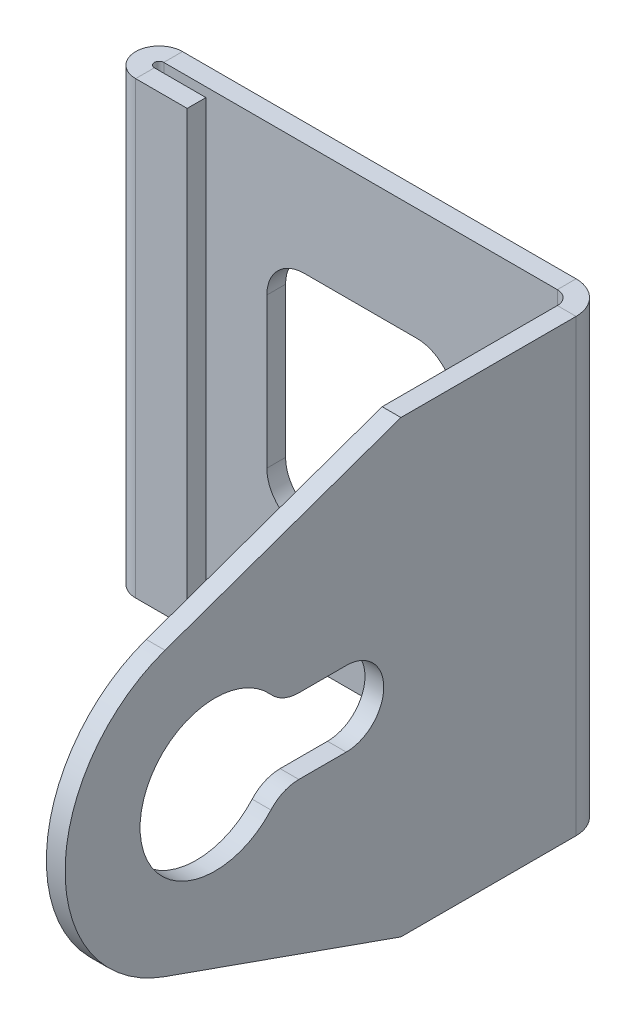
ISO-10303-21;
HEADER;
FILE_DESCRIPTION(('STEP AP214'),'2;1');
FILE_NAME('part.step','',(''),(''),'','','');
FILE_SCHEMA(('AUTOMOTIVE_DESIGN { 1 0 10303 214 1 1 1 1 }'));
ENDSEC;
DATA;
#1=APPLICATION_CONTEXT('core data for automotive mechanical design processes');
#2=APPLICATION_PROTOCOL_DEFINITION('international standard','automotive_design',2000,#1);
#3=PRODUCT_CONTEXT('',#1,'mechanical');
#4=PRODUCT('Part','Part','',(#3));
#5=PRODUCT_RELATED_PRODUCT_CATEGORY('part','',(#4));
#6=PRODUCT_DEFINITION_FORMATION('','',#4);
#7=PRODUCT_DEFINITION_CONTEXT('part definition',#1,'design');
#8=PRODUCT_DEFINITION('design','',#6,#7);
#9=PRODUCT_DEFINITION_SHAPE('','',#8);
#10=(LENGTH_UNIT() NAMED_UNIT(*) SI_UNIT(.MILLI.,.METRE.));
#11=(NAMED_UNIT(*) PLANE_ANGLE_UNIT() SI_UNIT($,.RADIAN.));
#12=(NAMED_UNIT(*) SI_UNIT($,.STERADIAN.) SOLID_ANGLE_UNIT());
#13=UNCERTAINTY_MEASURE_WITH_UNIT(LENGTH_MEASURE(1.E-05),#10,'distance_accuracy_value','');
#14=(GEOMETRIC_REPRESENTATION_CONTEXT(3) GLOBAL_UNCERTAINTY_ASSIGNED_CONTEXT((#13)) GLOBAL_UNIT_ASSIGNED_CONTEXT((#10,
#11,#12)) REPRESENTATION_CONTEXT('',''));
#15=CARTESIAN_POINT('',(0.,0.,0.));
#16=DIRECTION('',(0.,0.,1.));
#17=DIRECTION('',(1.,0.,0.));
#18=AXIS2_PLACEMENT_3D('',#15,#16,#17);
#19=CARTESIAN_POINT('',(-10.5,-12.,-1.));
#20=DIRECTION('',(0.,-1.,0.));
#21=DIRECTION('',(0.,0.,-1.));
#22=AXIS2_PLACEMENT_3D('',#19,#20,#21);
#23=PLANE('',#22);
#24=DIRECTION('',(1.,0.,0.));
#25=VECTOR('',#24,1.);
#26=CARTESIAN_POINT('',(-10.5,-12.,0.));
#27=LINE('',#26,#25);
#28=CARTESIAN_POINT('',(-10.5,-12.,0.));
#29=VERTEX_POINT('',#28);
#30=CARTESIAN_POINT('',(10.5,-12.,0.));
#31=VERTEX_POINT('',#30);
#32=EDGE_CURVE('E505',#29,#31,#27,.T.);
#33=ORIENTED_EDGE('',*,*,#32,.F.);
#34=DIRECTION('',(0.,0.,1.));
#35=VECTOR('',#34,1.);
#36=CARTESIAN_POINT('',(-10.5,-12.,-1.));
#37=LINE('',#36,#35);
#38=CARTESIAN_POINT('',(-10.5,-12.,-1.));
#39=VERTEX_POINT('',#38);
#40=EDGE_CURVE('E100',#39,#29,#37,.T.);
#41=ORIENTED_EDGE('',*,*,#40,.F.);
#42=DIRECTION('',(1.,0.,0.));
#43=VECTOR('',#42,1.);
#44=CARTESIAN_POINT('',(-10.5,-12.,-1.));
#45=LINE('',#44,#43);
#46=CARTESIAN_POINT('',(10.5,-12.,-1.));
#47=VERTEX_POINT('',#46);
#48=EDGE_CURVE('E510',#39,#47,#45,.T.);
#49=ORIENTED_EDGE('',*,*,#48,.T.);
#50=DIRECTION('',(0.,0.,1.));
#51=VECTOR('',#50,1.);
#52=CARTESIAN_POINT('',(10.5,-12.,-1.));
#53=LINE('',#52,#51);
#54=EDGE_CURVE('E13',#47,#31,#53,.T.);
#55=ORIENTED_EDGE('',*,*,#54,.T.);
#56=EDGE_LOOP('',(#33,#41,#49,#55));
#57=FACE_BOUND('',#56,.T.);
#58=ADVANCED_FACE('F91',(#57),#23,.T.);
#59=CARTESIAN_POINT('',(-10.5,12.,-1.));
#60=DIRECTION('',(0.,1.,0.));
#61=DIRECTION('',(0.,0.,1.));
#62=AXIS2_PLACEMENT_3D('',#59,#60,#61);
#63=PLANE('',#62);
#64=DIRECTION('',(-1.,0.,0.));
#65=VECTOR('',#64,1.);
#66=CARTESIAN_POINT('',(-10.5,12.,0.));
#67=LINE('',#66,#65);
#68=CARTESIAN_POINT('',(10.5,12.,0.));
#69=VERTEX_POINT('',#68);
#70=CARTESIAN_POINT('',(-10.5,12.,0.));
#71=VERTEX_POINT('',#70);
#72=EDGE_CURVE('E515',#69,#71,#67,.T.);
#73=ORIENTED_EDGE('',*,*,#72,.F.);
#74=DIRECTION('',(0.,0.,1.));
#75=VECTOR('',#74,1.);
#76=CARTESIAN_POINT('',(10.5,12.,-1.));
#77=LINE('',#76,#75);
#78=CARTESIAN_POINT('',(10.5,12.,-1.));
#79=VERTEX_POINT('',#78);
#80=EDGE_CURVE('E95',#79,#69,#77,.T.);
#81=ORIENTED_EDGE('',*,*,#80,.F.);
#82=DIRECTION('',(-1.,0.,0.));
#83=VECTOR('',#82,1.);
#84=CARTESIAN_POINT('',(-10.5,12.,-1.));
#85=LINE('',#84,#83);
#86=CARTESIAN_POINT('',(-10.5,12.,-1.));
#87=VERTEX_POINT('',#86);
#88=EDGE_CURVE('E504',#79,#87,#85,.T.);
#89=ORIENTED_EDGE('',*,*,#88,.T.);
#90=DIRECTION('',(0.,0.,1.));
#91=VECTOR('',#90,1.);
#92=CARTESIAN_POINT('',(-10.5,12.,-1.));
#93=LINE('',#92,#91);
#94=EDGE_CURVE('E314',#87,#71,#93,.T.);
#95=ORIENTED_EDGE('',*,*,#94,.T.);
#96=EDGE_LOOP('',(#73,#81,#89,#95));
#97=FACE_BOUND('',#96,.T.);
#98=ADVANCED_FACE('F93',(#97),#63,.T.);
#99=CARTESIAN_POINT('',(0.,0.,-1.));
#100=DIRECTION('',(0.,0.,1.));
#101=DIRECTION('',(1.,0.,0.));
#102=AXIS2_PLACEMENT_3D('',#99,#100,#101);
#103=PLANE('',#102);
#104=DIRECTION('',(0.,-1.,0.));
#105=VECTOR('',#104,1.);
#106=CARTESIAN_POINT('',(-5.,3.99999999999999,-1.));
#107=LINE('',#106,#105);
#108=CARTESIAN_POINT('',(-5.,3.99999999999999,-1.));
#109=VERTEX_POINT('',#108);
#110=CARTESIAN_POINT('',(-5.,-3.99999999999998,-1.));
#111=VERTEX_POINT('',#110);
#112=EDGE_CURVE('E460',#109,#111,#107,.T.);
#113=ORIENTED_EDGE('',*,*,#112,.T.);
#114=CARTESIAN_POINT('',(-3.,-4.,-1.));
#115=DIRECTION('',(0.,0.,1.));
#116=DIRECTION('',(1.,0.,0.));
#117=AXIS2_PLACEMENT_3D('',#114,#115,#116);
#118=CIRCLE('',#117,2.);
#119=CARTESIAN_POINT('',(-2.99999999999999,-6.,-1.));
#120=VERTEX_POINT('',#119);
#121=EDGE_CURVE('E440',#111,#120,#118,.T.);
#122=ORIENTED_EDGE('',*,*,#121,.T.);
#123=DIRECTION('',(1.,0.,0.));
#124=VECTOR('',#123,1.);
#125=CARTESIAN_POINT('',(-2.99999999999999,-6.,-1.));
#126=LINE('',#125,#124);
#127=CARTESIAN_POINT('',(2.99999999999999,-6.,-1.));
#128=VERTEX_POINT('',#127);
#129=EDGE_CURVE('E443',#120,#128,#126,.T.);
#130=ORIENTED_EDGE('',*,*,#129,.T.);
#131=CARTESIAN_POINT('',(3.,-4.,-1.));
#132=DIRECTION('',(0.,0.,1.));
#133=DIRECTION('',(1.,0.,0.));
#134=AXIS2_PLACEMENT_3D('',#131,#132,#133);
#135=CIRCLE('',#134,2.);
#136=CARTESIAN_POINT('',(5.,-3.99999999999998,-1.));
#137=VERTEX_POINT('',#136);
#138=EDGE_CURVE('E108',#128,#137,#135,.T.);
#139=ORIENTED_EDGE('',*,*,#138,.T.);
#140=DIRECTION('',(0.,1.,0.));
#141=VECTOR('',#140,1.);
#142=CARTESIAN_POINT('',(5.,3.99999999999999,-1.));
#143=LINE('',#142,#141);
#144=CARTESIAN_POINT('',(5.,3.99999999999999,-1.));
#145=VERTEX_POINT('',#144);
#146=EDGE_CURVE('E448',#137,#145,#143,.T.);
#147=ORIENTED_EDGE('',*,*,#146,.T.);
#148=CARTESIAN_POINT('',(3.,4.,-1.));
#149=DIRECTION('',(0.,0.,1.));
#150=DIRECTION('',(-1.,0.,0.));
#151=AXIS2_PLACEMENT_3D('',#148,#149,#150);
#152=CIRCLE('',#151,2.);
#153=CARTESIAN_POINT('',(2.99999999999999,6.,-1.));
#154=VERTEX_POINT('',#153);
#155=EDGE_CURVE('E451',#145,#154,#152,.T.);
#156=ORIENTED_EDGE('',*,*,#155,.T.);
#157=DIRECTION('',(-1.,0.,0.));
#158=VECTOR('',#157,1.);
#159=CARTESIAN_POINT('',(-2.99999999999999,6.,-1.));
#160=LINE('',#159,#158);
#161=CARTESIAN_POINT('',(-2.99999999999999,6.,-1.));
#162=VERTEX_POINT('',#161);
#163=EDGE_CURVE('E454',#154,#162,#160,.T.);
#164=ORIENTED_EDGE('',*,*,#163,.T.);
#165=CARTESIAN_POINT('',(-3.,4.,-1.));
#166=DIRECTION('',(0.,0.,1.));
#167=DIRECTION('',(1.,0.,0.));
#168=AXIS2_PLACEMENT_3D('',#165,#166,#167);
#169=CIRCLE('',#168,2.);
#170=EDGE_CURVE('E457',#162,#109,#169,.T.);
#171=ORIENTED_EDGE('',*,*,#170,.T.);
#172=EDGE_LOOP('',(#113,#122,#130,#139,#147,#156,#164,#171));
#173=FACE_BOUND('',#172,.T.);
#174=DIRECTION('',(0.,1.,0.));
#175=VECTOR('',#174,1.);
#176=CARTESIAN_POINT('',(10.5,12.,-1.));
#177=LINE('',#176,#175);
#178=EDGE_CURVE('E501',#47,#79,#177,.T.);
#179=ORIENTED_EDGE('',*,*,#178,.F.);
#180=ORIENTED_EDGE('',*,*,#48,.F.);
#181=DIRECTION('',(0.,-1.,0.));
#182=VECTOR('',#181,1.);
#183=CARTESIAN_POINT('',(-10.5,12.,-1.));
#184=LINE('',#183,#182);
#185=EDGE_CURVE('E508',#87,#39,#184,.T.);
#186=ORIENTED_EDGE('',*,*,#185,.F.);
#187=ORIENTED_EDGE('',*,*,#88,.F.);
#188=EDGE_LOOP('',(#179,#180,#186,#187));
#189=FACE_BOUND('',#188,.T.);
#190=ADVANCED_FACE('F603',(#173,#189),#103,.F.);
#191=CARTESIAN_POINT('',(0.,0.,0.));
#192=DIRECTION('',(0.,0.,1.));
#193=DIRECTION('',(1.,0.,0.));
#194=AXIS2_PLACEMENT_3D('',#191,#192,#193);
#195=PLANE('',#194);
#196=CARTESIAN_POINT('',(-3.,-4.,0.));
#197=DIRECTION('',(0.,0.,1.));
#198=DIRECTION('',(1.,0.,0.));
#199=AXIS2_PLACEMENT_3D('',#196,#197,#198);
#200=CIRCLE('',#199,2.);
#201=CARTESIAN_POINT('',(-5.,-3.99999999999998,0.));
#202=VERTEX_POINT('',#201);
#203=CARTESIAN_POINT('',(-2.99999999999999,-6.,0.));
#204=VERTEX_POINT('',#203);
#205=EDGE_CURVE('E116',#202,#204,#200,.T.);
#206=ORIENTED_EDGE('',*,*,#205,.F.);
#207=DIRECTION('',(0.,-1.,0.));
#208=VECTOR('',#207,1.);
#209=CARTESIAN_POINT('',(-5.,3.99999999999999,0.));
#210=LINE('',#209,#208);
#211=CARTESIAN_POINT('',(-5.,3.99999999999999,0.));
#212=VERTEX_POINT('',#211);
#213=EDGE_CURVE('E444',#212,#202,#210,.T.);
#214=ORIENTED_EDGE('',*,*,#213,.F.);
#215=CARTESIAN_POINT('',(-3.,4.,0.));
#216=DIRECTION('',(0.,0.,1.));
#217=DIRECTION('',(1.,0.,0.));
#218=AXIS2_PLACEMENT_3D('',#215,#216,#217);
#219=CIRCLE('',#218,2.);
#220=CARTESIAN_POINT('',(-2.99999999999999,6.,0.));
#221=VERTEX_POINT('',#220);
#222=EDGE_CURVE('E480',#221,#212,#219,.T.);
#223=ORIENTED_EDGE('',*,*,#222,.F.);
#224=DIRECTION('',(-1.,0.,0.));
#225=VECTOR('',#224,1.);
#226=CARTESIAN_POINT('',(-2.99999999999999,6.,0.));
#227=LINE('',#226,#225);
#228=CARTESIAN_POINT('',(2.99999999999999,6.,0.));
#229=VERTEX_POINT('',#228);
#230=EDGE_CURVE('E477',#229,#221,#227,.T.);
#231=ORIENTED_EDGE('',*,*,#230,.F.);
#232=CARTESIAN_POINT('',(3.,4.,0.));
#233=DIRECTION('',(0.,0.,1.));
#234=DIRECTION('',(-1.,0.,0.));
#235=AXIS2_PLACEMENT_3D('',#232,#233,#234);
#236=CIRCLE('',#235,2.);
#237=CARTESIAN_POINT('',(5.,3.99999999999999,0.));
#238=VERTEX_POINT('',#237);
#239=EDGE_CURVE('E474',#238,#229,#236,.T.);
#240=ORIENTED_EDGE('',*,*,#239,.F.);
#241=DIRECTION('',(0.,1.,0.));
#242=VECTOR('',#241,1.);
#243=CARTESIAN_POINT('',(5.,3.99999999999999,0.));
#244=LINE('',#243,#242);
#245=CARTESIAN_POINT('',(5.,-3.99999999999998,0.));
#246=VERTEX_POINT('',#245);
#247=EDGE_CURVE('E471',#246,#238,#244,.T.);
#248=ORIENTED_EDGE('',*,*,#247,.F.);
#249=CARTESIAN_POINT('',(3.,-4.,0.));
#250=DIRECTION('',(0.,0.,1.));
#251=DIRECTION('',(1.,0.,0.));
#252=AXIS2_PLACEMENT_3D('',#249,#250,#251);
#253=CIRCLE('',#252,2.);
#254=CARTESIAN_POINT('',(2.99999999999999,-6.,0.));
#255=VERTEX_POINT('',#254);
#256=EDGE_CURVE('E468',#255,#246,#253,.T.);
#257=ORIENTED_EDGE('',*,*,#256,.F.);
#258=DIRECTION('',(1.,0.,0.));
#259=VECTOR('',#258,1.);
#260=CARTESIAN_POINT('',(-2.99999999999999,-6.,0.));
#261=LINE('',#260,#259);
#262=EDGE_CURVE('E465',#204,#255,#261,.T.);
#263=ORIENTED_EDGE('',*,*,#262,.F.);
#264=EDGE_LOOP('',(#206,#214,#223,#231,#240,#248,#257,#263));
#265=FACE_BOUND('',#264,.T.);
#266=DIRECTION('',(0.,1.,0.));
#267=VECTOR('',#266,1.);
#268=CARTESIAN_POINT('',(10.5,12.,0.));
#269=LINE('',#268,#267);
#270=EDGE_CURVE('E487',#31,#69,#269,.T.);
#271=ORIENTED_EDGE('',*,*,#270,.T.);
#272=ORIENTED_EDGE('',*,*,#72,.T.);
#273=DIRECTION('',(0.,-1.,0.));
#274=VECTOR('',#273,1.);
#275=CARTESIAN_POINT('',(-10.5,12.,0.));
#276=LINE('',#275,#274);
#277=EDGE_CURVE('E518',#71,#29,#276,.T.);
#278=ORIENTED_EDGE('',*,*,#277,.T.);
#279=ORIENTED_EDGE('',*,*,#32,.T.);
#280=EDGE_LOOP('',(#271,#272,#278,#279));
#281=FACE_BOUND('',#280,.T.);
#282=ADVANCED_FACE('F573',(#265,#281),#195,.T.);
#283=CARTESIAN_POINT('',(-3.,-4.,-1.));
#284=DIRECTION('',(0.,0.,1.));
#285=DIRECTION('',(1.,0.,0.));
#286=AXIS2_PLACEMENT_3D('',#283,#284,#285);
#287=CYLINDRICAL_SURFACE('',#286,2.);
#288=ORIENTED_EDGE('',*,*,#205,.T.);
#289=DIRECTION('',(0.,0.,1.));
#290=VECTOR('',#289,1.);
#291=CARTESIAN_POINT('',(-2.99999999999999,-6.,-1.));
#292=LINE('',#291,#290);
#293=EDGE_CURVE('E463',#120,#204,#292,.T.);
#294=ORIENTED_EDGE('',*,*,#293,.F.);
#295=ORIENTED_EDGE('',*,*,#121,.F.);
#296=DIRECTION('',(0.,0.,1.));
#297=VECTOR('',#296,1.);
#298=CARTESIAN_POINT('',(-5.,-3.99999999999998,-1.));
#299=LINE('',#298,#297);
#300=EDGE_CURVE('E485',#111,#202,#299,.T.);
#301=ORIENTED_EDGE('',*,*,#300,.T.);
#302=EDGE_LOOP('',(#288,#294,#295,#301));
#303=FACE_BOUND('',#302,.T.);
#304=ADVANCED_FACE('F607',(#303),#287,.F.);
#305=CARTESIAN_POINT('',(-5.,3.99999999999999,-1.));
#306=DIRECTION('',(-1.,0.,0.));
#307=DIRECTION('',(0.,0.,1.));
#308=AXIS2_PLACEMENT_3D('',#305,#306,#307);
#309=PLANE('',#308);
#310=ORIENTED_EDGE('',*,*,#213,.T.);
#311=ORIENTED_EDGE('',*,*,#300,.F.);
#312=ORIENTED_EDGE('',*,*,#112,.F.);
#313=DIRECTION('',(0.,0.,1.));
#314=VECTOR('',#313,1.);
#315=CARTESIAN_POINT('',(-5.,3.99999999999999,-1.));
#316=LINE('',#315,#314);
#317=EDGE_CURVE('E488',#109,#212,#316,.T.);
#318=ORIENTED_EDGE('',*,*,#317,.T.);
#319=EDGE_LOOP('',(#310,#311,#312,#318));
#320=FACE_BOUND('',#319,.T.);
#321=ADVANCED_FACE('F614',(#320),#309,.F.);
#322=CARTESIAN_POINT('',(-3.,4.,-1.));
#323=DIRECTION('',(0.,0.,1.));
#324=DIRECTION('',(1.,0.,0.));
#325=AXIS2_PLACEMENT_3D('',#322,#323,#324);
#326=CYLINDRICAL_SURFACE('',#325,2.);
#327=ORIENTED_EDGE('',*,*,#222,.T.);
#328=ORIENTED_EDGE('',*,*,#317,.F.);
#329=ORIENTED_EDGE('',*,*,#170,.F.);
#330=DIRECTION('',(0.,0.,1.));
#331=VECTOR('',#330,1.);
#332=CARTESIAN_POINT('',(-2.99999999999999,6.,-1.));
#333=LINE('',#332,#331);
#334=EDGE_CURVE('E490',#162,#221,#333,.T.);
#335=ORIENTED_EDGE('',*,*,#334,.T.);
#336=EDGE_LOOP('',(#327,#328,#329,#335));
#337=FACE_BOUND('',#336,.T.);
#338=ADVANCED_FACE('F633',(#337),#326,.F.);
#339=CARTESIAN_POINT('',(-2.99999999999999,6.,-1.));
#340=DIRECTION('',(0.,1.,0.));
#341=DIRECTION('',(0.,0.,1.));
#342=AXIS2_PLACEMENT_3D('',#339,#340,#341);
#343=PLANE('',#342);
#344=ORIENTED_EDGE('',*,*,#230,.T.);
#345=ORIENTED_EDGE('',*,*,#334,.F.);
#346=ORIENTED_EDGE('',*,*,#163,.F.);
#347=DIRECTION('',(0.,0.,1.));
#348=VECTOR('',#347,1.);
#349=CARTESIAN_POINT('',(2.99999999999999,6.,-1.));
#350=LINE('',#349,#348);
#351=EDGE_CURVE('E492',#154,#229,#350,.T.);
#352=ORIENTED_EDGE('',*,*,#351,.T.);
#353=EDGE_LOOP('',(#344,#345,#346,#352));
#354=FACE_BOUND('',#353,.T.);
#355=ADVANCED_FACE('F629',(#354),#343,.F.);
#356=CARTESIAN_POINT('',(3.,4.,-1.));
#357=DIRECTION('',(0.,0.,1.));
#358=DIRECTION('',(1.,0.,0.));
#359=AXIS2_PLACEMENT_3D('',#356,#357,#358);
#360=CYLINDRICAL_SURFACE('',#359,2.);
#361=ORIENTED_EDGE('',*,*,#239,.T.);
#362=ORIENTED_EDGE('',*,*,#351,.F.);
#363=ORIENTED_EDGE('',*,*,#155,.F.);
#364=DIRECTION('',(0.,0.,1.));
#365=VECTOR('',#364,1.);
#366=CARTESIAN_POINT('',(5.,3.99999999999999,-1.));
#367=LINE('',#366,#365);
#368=EDGE_CURVE('E494',#145,#238,#367,.T.);
#369=ORIENTED_EDGE('',*,*,#368,.T.);
#370=EDGE_LOOP('',(#361,#362,#363,#369));
#371=FACE_BOUND('',#370,.T.);
#372=ADVANCED_FACE('F625',(#371),#360,.F.);
#373=CARTESIAN_POINT('',(5.,3.99999999999999,-1.));
#374=DIRECTION('',(1.,0.,0.));
#375=DIRECTION('',(0.,0.,-1.));
#376=AXIS2_PLACEMENT_3D('',#373,#374,#375);
#377=PLANE('',#376);
#378=ORIENTED_EDGE('',*,*,#247,.T.);
#379=ORIENTED_EDGE('',*,*,#368,.F.);
#380=ORIENTED_EDGE('',*,*,#146,.F.);
#381=DIRECTION('',(0.,0.,1.));
#382=VECTOR('',#381,1.);
#383=CARTESIAN_POINT('',(5.,-3.99999999999998,-1.));
#384=LINE('',#383,#382);
#385=EDGE_CURVE('E496',#137,#246,#384,.T.);
#386=ORIENTED_EDGE('',*,*,#385,.T.);
#387=EDGE_LOOP('',(#378,#379,#380,#386));
#388=FACE_BOUND('',#387,.T.);
#389=ADVANCED_FACE('F622',(#388),#377,.F.);
#390=CARTESIAN_POINT('',(3.,-4.,-1.));
#391=DIRECTION('',(0.,0.,1.));
#392=DIRECTION('',(1.,0.,0.));
#393=AXIS2_PLACEMENT_3D('',#390,#391,#392);
#394=CYLINDRICAL_SURFACE('',#393,2.);
#395=ORIENTED_EDGE('',*,*,#256,.T.);
#396=ORIENTED_EDGE('',*,*,#385,.F.);
#397=ORIENTED_EDGE('',*,*,#138,.F.);
#398=DIRECTION('',(0.,0.,1.));
#399=VECTOR('',#398,1.);
#400=CARTESIAN_POINT('',(2.99999999999999,-6.,-1.));
#401=LINE('',#400,#399);
#402=EDGE_CURVE('E498',#128,#255,#401,.T.);
#403=ORIENTED_EDGE('',*,*,#402,.T.);
#404=EDGE_LOOP('',(#395,#396,#397,#403));
#405=FACE_BOUND('',#404,.T.);
#406=ADVANCED_FACE('F618',(#405),#394,.F.);
#407=CARTESIAN_POINT('',(-2.99999999999999,-6.,-1.));
#408=DIRECTION('',(0.,-1.,0.));
#409=DIRECTION('',(0.,0.,-1.));
#410=AXIS2_PLACEMENT_3D('',#407,#408,#409);
#411=PLANE('',#410);
#412=ORIENTED_EDGE('',*,*,#262,.T.);
#413=ORIENTED_EDGE('',*,*,#402,.F.);
#414=ORIENTED_EDGE('',*,*,#129,.F.);
#415=ORIENTED_EDGE('',*,*,#293,.T.);
#416=EDGE_LOOP('',(#412,#413,#414,#415));
#417=FACE_BOUND('',#416,.T.);
#418=ADVANCED_FACE('F615',(#417),#411,.F.);
#419=CARTESIAN_POINT('',(10.5,-12.,0.7366));
#420=DIRECTION('',(0.,-1.,0.));
#421=DIRECTION('',(0.,0.,-1.));
#422=AXIS2_PLACEMENT_3D('',#419,#420,#421);
#423=PLANE('',#422);
#424=DIRECTION('',(-1.,0.,0.));
#425=VECTOR('',#424,1.);
#426=CARTESIAN_POINT('',(12.2366,-12.,0.736599999999993));
#427=LINE('',#426,#425);
#428=CARTESIAN_POINT('',(11.2366,-12.,0.736599999999997));
#429=VERTEX_POINT('',#428);
#430=CARTESIAN_POINT('',(12.2366,-12.,0.736599999999993));
#431=VERTEX_POINT('',#430);
#432=EDGE_CURVE('E299',#429,#431,#427,.F.);
#433=ORIENTED_EDGE('',*,*,#432,.F.);
#434=CARTESIAN_POINT('',(10.5,-12.,0.7366));
#435=DIRECTION('',(0.,1.,0.));
#436=DIRECTION('',(0.,0.,1.));
#437=AXIS2_PLACEMENT_3D('',#434,#435,#436);
#438=CIRCLE('',#437,0.7366);
#439=EDGE_CURVE('E435',#31,#429,#438,.F.);
#440=ORIENTED_EDGE('',*,*,#439,.F.);
#441=ORIENTED_EDGE('',*,*,#54,.F.);
#442=CARTESIAN_POINT('',(10.5,-12.,0.7366));
#443=DIRECTION('',(0.,1.,0.));
#444=DIRECTION('',(0.,0.,1.));
#445=AXIS2_PLACEMENT_3D('',#442,#443,#444);
#446=CIRCLE('',#445,1.7366);
#447=EDGE_CURVE('E429',#47,#431,#446,.F.);
#448=ORIENTED_EDGE('',*,*,#447,.T.);
#449=EDGE_LOOP('',(#433,#440,#441,#448));
#450=FACE_BOUND('',#449,.T.);
#451=ADVANCED_FACE('F569',(#450),#423,.T.);
#452=CARTESIAN_POINT('',(10.5,12.,0.7366));
#453=DIRECTION('',(0.,-1.,0.));
#454=DIRECTION('',(0.,0.,-1.));
#455=AXIS2_PLACEMENT_3D('',#452,#453,#454);
#456=PLANE('',#455);
#457=CARTESIAN_POINT('',(10.5,12.,0.7366));
#458=DIRECTION('',(0.,1.,0.));
#459=DIRECTION('',(0.,0.,1.));
#460=AXIS2_PLACEMENT_3D('',#457,#458,#459);
#461=CIRCLE('',#460,0.7366);
#462=CARTESIAN_POINT('',(11.2366,12.,0.736599999999997));
#463=VERTEX_POINT('',#462);
#464=EDGE_CURVE('E365',#463,#69,#461,.T.);
#465=ORIENTED_EDGE('',*,*,#464,.F.);
#466=DIRECTION('',(-1.,0.,0.));
#467=VECTOR('',#466,1.);
#468=CARTESIAN_POINT('',(11.2366,12.,0.736599999999997));
#469=LINE('',#468,#467);
#470=CARTESIAN_POINT('',(12.2366,12.,0.736599999999993));
#471=VERTEX_POINT('',#470);
#472=EDGE_CURVE('E422',#463,#471,#469,.F.);
#473=ORIENTED_EDGE('',*,*,#472,.T.);
#474=CARTESIAN_POINT('',(10.5,12.,0.7366));
#475=DIRECTION('',(0.,1.,0.));
#476=DIRECTION('',(0.,0.,1.));
#477=AXIS2_PLACEMENT_3D('',#474,#475,#476);
#478=CIRCLE('',#477,1.7366);
#479=EDGE_CURVE('E432',#471,#79,#478,.T.);
#480=ORIENTED_EDGE('',*,*,#479,.T.);
#481=ORIENTED_EDGE('',*,*,#80,.T.);
#482=EDGE_LOOP('',(#465,#473,#480,#481));
#483=FACE_BOUND('',#482,.T.);
#484=ADVANCED_FACE('F529',(#483),#456,.F.);
#485=CARTESIAN_POINT('',(10.5,12.,0.7366));
#486=DIRECTION('',(0.,1.,0.));
#487=DIRECTION('',(1.,0.,0.));
#488=AXIS2_PLACEMENT_3D('',#485,#486,#487);
#489=CYLINDRICAL_SURFACE('',#488,1.7366);
#490=ORIENTED_EDGE('',*,*,#178,.T.);
#491=ORIENTED_EDGE('',*,*,#479,.F.);
#492=DIRECTION('',(0.,1.,0.));
#493=VECTOR('',#492,1.);
#494=CARTESIAN_POINT('',(12.2366,0.,0.736599999999993));
#495=LINE('',#494,#493);
#496=EDGE_CURVE('E419',#431,#471,#495,.T.);
#497=ORIENTED_EDGE('',*,*,#496,.F.);
#498=ORIENTED_EDGE('',*,*,#447,.F.);
#499=EDGE_LOOP('',(#490,#491,#497,#498));
#500=FACE_BOUND('',#499,.T.);
#501=ADVANCED_FACE('F566',(#500),#489,.T.);
#502=CARTESIAN_POINT('',(10.5,12.,0.7366));
#503=DIRECTION('',(0.,1.,0.));
#504=DIRECTION('',(1.,0.,0.));
#505=AXIS2_PLACEMENT_3D('',#502,#503,#504);
#506=CYLINDRICAL_SURFACE('',#505,0.7366);
#507=ORIENTED_EDGE('',*,*,#270,.F.);
#508=ORIENTED_EDGE('',*,*,#439,.T.);
#509=DIRECTION('',(0.,-1.,0.));
#510=VECTOR('',#509,1.);
#511=CARTESIAN_POINT('',(11.2366,-12.,0.736599999999997));
#512=LINE('',#511,#510);
#513=EDGE_CURVE('E425',#429,#463,#512,.F.);
#514=ORIENTED_EDGE('',*,*,#513,.T.);
#515=ORIENTED_EDGE('',*,*,#464,.T.);
#516=EDGE_LOOP('',(#507,#508,#514,#515));
#517=FACE_BOUND('',#516,.T.);
#518=ADVANCED_FACE('F533',(#517),#506,.F.);
#519=CARTESIAN_POINT('',(12.2366000000001,0.,20.));
#520=DIRECTION('',(1.,0.,0.));
#521=DIRECTION('',(0.,0.,-1.));
#522=AXIS2_PLACEMENT_3D('',#519,#520,#521);
#523=PLANE('',#522);
#524=DIRECTION('',(0.,0.,1.));
#525=VECTOR('',#524,1.);
#526=CARTESIAN_POINT('',(12.2366,2.,13.));
#527=LINE('',#526,#525);
#528=CARTESIAN_POINT('',(12.2366,2.,13.));
#529=VERTEX_POINT('',#528);
#530=CARTESIAN_POINT('',(12.2366000000001,2.,15.5278640450004));
#531=VERTEX_POINT('',#530);
#532=EDGE_CURVE('E397',#529,#531,#527,.T.);
#533=ORIENTED_EDGE('',*,*,#532,.F.);
#534=CARTESIAN_POINT('',(12.2366,0.,13.));
#535=DIRECTION('',(1.,0.,0.));
#536=DIRECTION('',(0.,0.,-1.));
#537=AXIS2_PLACEMENT_3D('',#534,#535,#536);
#538=CIRCLE('',#537,2.);
#539=CARTESIAN_POINT('',(12.2366,-2.,13.));
#540=VERTEX_POINT('',#539);
#541=EDGE_CURVE('E399',#540,#529,#538,.T.);
#542=ORIENTED_EDGE('',*,*,#541,.F.);
#543=DIRECTION('',(0.,0.,-1.));
#544=VECTOR('',#543,1.);
#545=CARTESIAN_POINT('',(12.2366,-2.,13.));
#546=LINE('',#545,#544);
#547=CARTESIAN_POINT('',(12.2366000000001,-2.,15.5278640450004));
#548=VERTEX_POINT('',#547);
#549=EDGE_CURVE('E343',#548,#540,#546,.T.);
#550=ORIENTED_EDGE('',*,*,#549,.F.);
#551=CARTESIAN_POINT('',(12.2366000000001,-4.,15.5278640450004));
#552=DIRECTION('',(1.,0.,0.));
#553=DIRECTION('',(0.,0.,-1.));
#554=AXIS2_PLACEMENT_3D('',#551,#552,#553);
#555=CIRCLE('',#554,2.);
#556=CARTESIAN_POINT('',(12.2366000000001,-2.66666666666667,17.0185760300003));
#557=VERTEX_POINT('',#556);
#558=EDGE_CURVE('E390',#557,#548,#555,.F.);
#559=ORIENTED_EDGE('',*,*,#558,.F.);
#560=CARTESIAN_POINT('',(12.2366000000001,0.,20.));
#561=DIRECTION('',(1.,0.,0.));
#562=DIRECTION('',(0.,0.,-1.));
#563=AXIS2_PLACEMENT_3D('',#560,#561,#562);
#564=CIRCLE('',#563,4.);
#565=CARTESIAN_POINT('',(12.2366000000001,2.66666666666667,17.0185760300003));
#566=VERTEX_POINT('',#565);
#567=EDGE_CURVE('E393',#566,#557,#564,.T.);
#568=ORIENTED_EDGE('',*,*,#567,.F.);
#569=CARTESIAN_POINT('',(12.2366000000001,4.,15.5278640450004));
#570=DIRECTION('',(1.,0.,0.));
#571=DIRECTION('',(0.,0.,-1.));
#572=AXIS2_PLACEMENT_3D('',#569,#570,#571);
#573=CIRCLE('',#572,2.);
#574=EDGE_CURVE('E395',#531,#566,#573,.F.);
#575=ORIENTED_EDGE('',*,*,#574,.F.);
#576=EDGE_LOOP('',(#533,#542,#550,#559,#568,#575));
#577=FACE_BOUND('',#576,.T.);
#578=DIRECTION('',(0.,0.,1.));
#579=VECTOR('',#578,1.);
#580=CARTESIAN_POINT('',(12.2366000000001,-12.,20.));
#581=LINE('',#580,#579);
#582=CARTESIAN_POINT('',(12.2366,-12.,10.0825346324618));
#583=VERTEX_POINT('',#582);
#584=EDGE_CURVE('E376',#583,#431,#581,.F.);
#585=ORIENTED_EDGE('',*,*,#584,.T.);
#586=ORIENTED_EDGE('',*,*,#496,.T.);
#587=DIRECTION('',(0.,0.,-1.));
#588=VECTOR('',#587,1.);
#589=CARTESIAN_POINT('',(12.2366000000001,12.,20.));
#590=LINE('',#589,#588);
#591=CARTESIAN_POINT('',(12.2366,12.,10.0825346324618));
#592=VERTEX_POINT('',#591);
#593=EDGE_CURVE('E374',#471,#592,#590,.F.);
#594=ORIENTED_EDGE('',*,*,#593,.T.);
#595=DIRECTION('',(0.,0.333890143403228,-0.942611994480323));
#596=VECTOR('',#595,1.);
#597=CARTESIAN_POINT('',(12.2366000000001,7.54089595584258,22.6711211472258));
#598=LINE('',#597,#596);
#599=CARTESIAN_POINT('',(12.2366000000001,7.54089595584258,22.6711211472258));
#600=VERTEX_POINT('',#599);
#601=EDGE_CURVE('E372',#592,#600,#598,.F.);
#602=ORIENTED_EDGE('',*,*,#601,.T.);
#603=CARTESIAN_POINT('',(12.2366000000001,0.,20.));
#604=DIRECTION('',(1.,0.,0.));
#605=DIRECTION('',(0.,0.,-1.));
#606=AXIS2_PLACEMENT_3D('',#603,#604,#605);
#607=CIRCLE('',#606,8.);
#608=CARTESIAN_POINT('',(12.2366000000001,-7.54089595584258,22.6711211472258));
#609=VERTEX_POINT('',#608);
#610=EDGE_CURVE('E370',#600,#609,#607,.T.);
#611=ORIENTED_EDGE('',*,*,#610,.T.);
#612=DIRECTION('',(0.,0.333890143403228,0.942611994480323));
#613=VECTOR('',#612,1.);
#614=CARTESIAN_POINT('',(12.2366000000001,-7.54089595584258,22.6711211472258));
#615=LINE('',#614,#613);
#616=EDGE_CURVE('E368',#609,#583,#615,.F.);
#617=ORIENTED_EDGE('',*,*,#616,.T.);
#618=EDGE_LOOP('',(#585,#586,#594,#602,#611,#617));
#619=FACE_BOUND('',#618,.T.);
#620=ADVANCED_FACE('F563',(#577,#619),#523,.T.);
#621=CARTESIAN_POINT('',(11.2366000000001,0.,20.));
#622=DIRECTION('',(1.,0.,0.));
#623=DIRECTION('',(0.,0.,-1.));
#624=AXIS2_PLACEMENT_3D('',#621,#622,#623);
#625=PLANE('',#624);
#626=CARTESIAN_POINT('',(11.2366,0.,13.));
#627=DIRECTION('',(1.,0.,0.));
#628=DIRECTION('',(0.,0.,-1.));
#629=AXIS2_PLACEMENT_3D('',#626,#627,#628);
#630=CIRCLE('',#629,2.);
#631=CARTESIAN_POINT('',(11.2366,-2.,13.));
#632=VERTEX_POINT('',#631);
#633=CARTESIAN_POINT('',(11.2366,2.,13.));
#634=VERTEX_POINT('',#633);
#635=EDGE_CURVE('E416',#632,#634,#630,.T.);
#636=ORIENTED_EDGE('',*,*,#635,.T.);
#637=DIRECTION('',(0.,0.,-1.));
#638=VECTOR('',#637,1.);
#639=CARTESIAN_POINT('',(11.2366000000001,2.,20.));
#640=LINE('',#639,#638);
#641=CARTESIAN_POINT('',(11.2366000000001,2.,15.5278640450004));
#642=VERTEX_POINT('',#641);
#643=EDGE_CURVE('E413',#634,#642,#640,.F.);
#644=ORIENTED_EDGE('',*,*,#643,.T.);
#645=CARTESIAN_POINT('',(11.2366000000001,4.,15.5278640450004));
#646=DIRECTION('',(1.,0.,0.));
#647=DIRECTION('',(0.,0.,-1.));
#648=AXIS2_PLACEMENT_3D('',#645,#646,#647);
#649=CIRCLE('',#648,2.);
#650=CARTESIAN_POINT('',(11.2366000000001,2.66666666666667,17.0185760300003));
#651=VERTEX_POINT('',#650);
#652=EDGE_CURVE('E410',#642,#651,#649,.F.);
#653=ORIENTED_EDGE('',*,*,#652,.T.);
#654=CARTESIAN_POINT('',(11.2366000000001,0.,20.));
#655=DIRECTION('',(1.,0.,0.));
#656=DIRECTION('',(0.,0.,-1.));
#657=AXIS2_PLACEMENT_3D('',#654,#655,#656);
#658=CIRCLE('',#657,4.);
#659=CARTESIAN_POINT('',(11.2366000000001,-2.66666666666667,17.0185760300003));
#660=VERTEX_POINT('',#659);
#661=EDGE_CURVE('E407',#651,#660,#658,.T.);
#662=ORIENTED_EDGE('',*,*,#661,.T.);
#663=CARTESIAN_POINT('',(11.2366000000001,-4.,15.5278640450004));
#664=DIRECTION('',(1.,0.,0.));
#665=DIRECTION('',(0.,0.,-1.));
#666=AXIS2_PLACEMENT_3D('',#663,#664,#665);
#667=CIRCLE('',#666,2.);
#668=CARTESIAN_POINT('',(11.2366000000001,-2.,15.5278640450004));
#669=VERTEX_POINT('',#668);
#670=EDGE_CURVE('E404',#660,#669,#667,.F.);
#671=ORIENTED_EDGE('',*,*,#670,.T.);
#672=DIRECTION('',(0.,0.,1.));
#673=VECTOR('',#672,1.);
#674=CARTESIAN_POINT('',(11.2366000000001,-2.,20.));
#675=LINE('',#674,#673);
#676=EDGE_CURVE('E401',#669,#632,#675,.F.);
#677=ORIENTED_EDGE('',*,*,#676,.T.);
#678=EDGE_LOOP('',(#636,#644,#653,#662,#671,#677));
#679=FACE_BOUND('',#678,.T.);
#680=ORIENTED_EDGE('',*,*,#513,.F.);
#681=DIRECTION('',(0.,0.,-1.));
#682=VECTOR('',#681,1.);
#683=CARTESIAN_POINT('',(11.2366,-12.,0.));
#684=LINE('',#683,#682);
#685=CARTESIAN_POINT('',(11.2366,-12.,10.0825346324618));
#686=VERTEX_POINT('',#685);
#687=EDGE_CURVE('E354',#686,#429,#684,.T.);
#688=ORIENTED_EDGE('',*,*,#687,.F.);
#689=DIRECTION('',(0.,-0.333890143403228,-0.942611994480323));
#690=VECTOR('',#689,1.);
#691=CARTESIAN_POINT('',(11.2366000000001,-7.54089595584258,22.6711211472258));
#692=LINE('',#691,#690);
#693=CARTESIAN_POINT('',(11.2366000000001,-7.54089595584258,22.6711211472258));
#694=VERTEX_POINT('',#693);
#695=EDGE_CURVE('E379',#694,#686,#692,.T.);
#696=ORIENTED_EDGE('',*,*,#695,.F.);
#697=CARTESIAN_POINT('',(11.2366000000001,0.,20.));
#698=DIRECTION('',(1.,0.,0.));
#699=DIRECTION('',(0.,0.,-1.));
#700=AXIS2_PLACEMENT_3D('',#697,#698,#699);
#701=CIRCLE('',#700,8.);
#702=CARTESIAN_POINT('',(11.2366000000001,7.54089595584258,22.6711211472258));
#703=VERTEX_POINT('',#702);
#704=EDGE_CURVE('E381',#703,#694,#701,.T.);
#705=ORIENTED_EDGE('',*,*,#704,.F.);
#706=DIRECTION('',(0.,-0.333890143403228,0.942611994480323));
#707=VECTOR('',#706,1.);
#708=CARTESIAN_POINT('',(11.2366000000001,7.54089595584258,22.6711211472258));
#709=LINE('',#708,#707);
#710=CARTESIAN_POINT('',(11.2366,12.,10.0825346324618));
#711=VERTEX_POINT('',#710);
#712=EDGE_CURVE('E383',#711,#703,#709,.T.);
#713=ORIENTED_EDGE('',*,*,#712,.F.);
#714=DIRECTION('',(0.,0.,1.));
#715=VECTOR('',#714,1.);
#716=CARTESIAN_POINT('',(11.2366,12.,10.0825346324618));
#717=LINE('',#716,#715);
#718=EDGE_CURVE('E385',#463,#711,#717,.T.);
#719=ORIENTED_EDGE('',*,*,#718,.F.);
#720=EDGE_LOOP('',(#680,#688,#696,#705,#713,#719));
#721=FACE_BOUND('',#720,.T.);
#722=ADVANCED_FACE('F539',(#679,#721),#625,.F.);
#723=CARTESIAN_POINT('',(12.2366,-12.,0.));
#724=DIRECTION('',(0.,1.,0.));
#725=DIRECTION('',(-1.,0.,0.));
#726=AXIS2_PLACEMENT_3D('',#723,#724,#725);
#727=PLANE('',#726);
#728=ORIENTED_EDGE('',*,*,#432,.T.);
#729=ORIENTED_EDGE('',*,*,#584,.F.);
#730=DIRECTION('',(-1.,0.,0.));
#731=VECTOR('',#730,1.);
#732=CARTESIAN_POINT('',(12.2366,-12.,10.0825346324618));
#733=LINE('',#732,#731);
#734=EDGE_CURVE('E359',#583,#686,#733,.T.);
#735=ORIENTED_EDGE('',*,*,#734,.T.);
#736=ORIENTED_EDGE('',*,*,#687,.T.);
#737=EDGE_LOOP('',(#728,#729,#735,#736));
#738=FACE_BOUND('',#737,.T.);
#739=ADVANCED_FACE('F543',(#738),#727,.F.);
#740=CARTESIAN_POINT('',(12.2366,12.,10.0825346324618));
#741=DIRECTION('',(0.,-1.,0.));
#742=DIRECTION('',(0.,0.,-1.));
#743=AXIS2_PLACEMENT_3D('',#740,#741,#742);
#744=PLANE('',#743);
#745=ORIENTED_EDGE('',*,*,#472,.F.);
#746=ORIENTED_EDGE('',*,*,#718,.T.);
#747=DIRECTION('',(-1.,0.,0.));
#748=VECTOR('',#747,1.);
#749=CARTESIAN_POINT('',(12.2366,12.,10.0825346324618));
#750=LINE('',#749,#748);
#751=EDGE_CURVE('E362',#592,#711,#750,.T.);
#752=ORIENTED_EDGE('',*,*,#751,.F.);
#753=ORIENTED_EDGE('',*,*,#593,.F.);
#754=EDGE_LOOP('',(#745,#746,#752,#753));
#755=FACE_BOUND('',#754,.T.);
#756=ADVANCED_FACE('F561',(#755),#744,.F.);
#757=CARTESIAN_POINT('',(12.2366000000001,7.54089595584258,22.6711211472258));
#758=DIRECTION('',(0.,-0.942611994480323,-0.333890143403228));
#759=DIRECTION('',(0.,0.333890143403228,-0.942611994480323));
#760=AXIS2_PLACEMENT_3D('',#757,#758,#759);
#761=PLANE('',#760);
#762=ORIENTED_EDGE('',*,*,#712,.T.);
#763=DIRECTION('',(-1.,0.,0.));
#764=VECTOR('',#763,1.);
#765=CARTESIAN_POINT('',(12.2366000000001,7.54089595584258,22.6711211472258));
#766=LINE('',#765,#764);
#767=EDGE_CURVE('E358',#600,#703,#766,.T.);
#768=ORIENTED_EDGE('',*,*,#767,.F.);
#769=ORIENTED_EDGE('',*,*,#601,.F.);
#770=ORIENTED_EDGE('',*,*,#751,.T.);
#771=EDGE_LOOP('',(#762,#768,#769,#770));
#772=FACE_BOUND('',#771,.T.);
#773=ADVANCED_FACE('F557',(#772),#761,.F.);
#774=CARTESIAN_POINT('',(12.2366000000001,0.,20.));
#775=DIRECTION('',(-1.,0.,0.));
#776=DIRECTION('',(0.,0.,1.));
#777=AXIS2_PLACEMENT_3D('',#774,#775,#776);
#778=CYLINDRICAL_SURFACE('',#777,8.);
#779=ORIENTED_EDGE('',*,*,#704,.T.);
#780=DIRECTION('',(-1.,0.,0.));
#781=VECTOR('',#780,1.);
#782=CARTESIAN_POINT('',(12.2366000000001,-7.54089595584258,22.6711211472258));
#783=LINE('',#782,#781);
#784=EDGE_CURVE('E355',#609,#694,#783,.T.);
#785=ORIENTED_EDGE('',*,*,#784,.F.);
#786=ORIENTED_EDGE('',*,*,#610,.F.);
#787=ORIENTED_EDGE('',*,*,#767,.T.);
#788=EDGE_LOOP('',(#779,#785,#786,#787));
#789=FACE_BOUND('',#788,.T.);
#790=ADVANCED_FACE('F552',(#789),#778,.T.);
#791=CARTESIAN_POINT('',(12.2366000000001,-7.54089595584258,22.6711211472258));
#792=DIRECTION('',(0.,0.942611994480323,-0.333890143403228));
#793=DIRECTION('',(0.,0.333890143403228,0.942611994480323));
#794=AXIS2_PLACEMENT_3D('',#791,#792,#793);
#795=PLANE('',#794);
#796=ORIENTED_EDGE('',*,*,#695,.T.);
#797=ORIENTED_EDGE('',*,*,#734,.F.);
#798=ORIENTED_EDGE('',*,*,#616,.F.);
#799=ORIENTED_EDGE('',*,*,#784,.T.);
#800=EDGE_LOOP('',(#796,#797,#798,#799));
#801=FACE_BOUND('',#800,.T.);
#802=ADVANCED_FACE('F548',(#801),#795,.F.);
#803=CARTESIAN_POINT('',(12.2366,0.,13.));
#804=DIRECTION('',(-1.,0.,0.));
#805=DIRECTION('',(0.,0.,1.));
#806=AXIS2_PLACEMENT_3D('',#803,#804,#805);
#807=CYLINDRICAL_SURFACE('',#806,2.);
#808=ORIENTED_EDGE('',*,*,#635,.F.);
#809=DIRECTION('',(-1.,0.,0.));
#810=VECTOR('',#809,1.);
#811=CARTESIAN_POINT('',(12.2366,-2.,13.));
#812=LINE('',#811,#810);
#813=EDGE_CURVE('E339',#540,#632,#812,.T.);
#814=ORIENTED_EDGE('',*,*,#813,.F.);
#815=ORIENTED_EDGE('',*,*,#541,.T.);
#816=DIRECTION('',(-1.,0.,0.));
#817=VECTOR('',#816,1.);
#818=CARTESIAN_POINT('',(12.2366,2.,13.));
#819=LINE('',#818,#817);
#820=EDGE_CURVE('E351',#529,#634,#819,.T.);
#821=ORIENTED_EDGE('',*,*,#820,.T.);
#822=EDGE_LOOP('',(#808,#814,#815,#821));
#823=FACE_BOUND('',#822,.T.);
#824=ADVANCED_FACE('F659',(#823),#807,.F.);
#825=CARTESIAN_POINT('',(12.2366,2.,13.));
#826=DIRECTION('',(0.,-1.,0.));
#827=DIRECTION('',(0.,0.,-1.));
#828=AXIS2_PLACEMENT_3D('',#825,#826,#827);
#829=PLANE('',#828);
#830=ORIENTED_EDGE('',*,*,#643,.F.);
#831=ORIENTED_EDGE('',*,*,#820,.F.);
#832=ORIENTED_EDGE('',*,*,#532,.T.);
#833=DIRECTION('',(-1.,0.,0.));
#834=VECTOR('',#833,1.);
#835=CARTESIAN_POINT('',(12.2366000000001,2.,15.5278640450004));
#836=LINE('',#835,#834);
#837=EDGE_CURVE('E349',#531,#642,#836,.T.);
#838=ORIENTED_EDGE('',*,*,#837,.T.);
#839=EDGE_LOOP('',(#830,#831,#832,#838));
#840=FACE_BOUND('',#839,.T.);
#841=ADVANCED_FACE('F668',(#840),#829,.T.);
#842=CARTESIAN_POINT('',(12.2366000000001,4.,15.5278640450004));
#843=DIRECTION('',(-1.,0.,0.));
#844=DIRECTION('',(0.,0.,1.));
#845=AXIS2_PLACEMENT_3D('',#842,#843,#844);
#846=CYLINDRICAL_SURFACE('',#845,2.);
#847=ORIENTED_EDGE('',*,*,#652,.F.);
#848=ORIENTED_EDGE('',*,*,#837,.F.);
#849=ORIENTED_EDGE('',*,*,#574,.T.);
#850=DIRECTION('',(-1.,0.,0.));
#851=VECTOR('',#850,1.);
#852=CARTESIAN_POINT('',(12.2366000000001,2.66666666666667,17.0185760300003));
#853=LINE('',#852,#851);
#854=EDGE_CURVE('E347',#566,#651,#853,.T.);
#855=ORIENTED_EDGE('',*,*,#854,.T.);
#856=EDGE_LOOP('',(#847,#848,#849,#855));
#857=FACE_BOUND('',#856,.T.);
#858=ADVANCED_FACE('F672',(#857),#846,.T.);
#859=CARTESIAN_POINT('',(12.2366000000001,0.,20.));
#860=DIRECTION('',(-1.,0.,0.));
#861=DIRECTION('',(0.,0.,1.));
#862=AXIS2_PLACEMENT_3D('',#859,#860,#861);
#863=CYLINDRICAL_SURFACE('',#862,4.);
#864=ORIENTED_EDGE('',*,*,#661,.F.);
#865=ORIENTED_EDGE('',*,*,#854,.F.);
#866=ORIENTED_EDGE('',*,*,#567,.T.);
#867=DIRECTION('',(-1.,0.,0.));
#868=VECTOR('',#867,1.);
#869=CARTESIAN_POINT('',(12.2366000000001,-2.66666666666667,17.0185760300003));
#870=LINE('',#869,#868);
#871=EDGE_CURVE('E345',#557,#660,#870,.T.);
#872=ORIENTED_EDGE('',*,*,#871,.T.);
#873=EDGE_LOOP('',(#864,#865,#866,#872));
#874=FACE_BOUND('',#873,.T.);
#875=ADVANCED_FACE('F676',(#874),#863,.F.);
#876=CARTESIAN_POINT('',(12.2366000000001,-4.,15.5278640450004));
#877=DIRECTION('',(-1.,0.,0.));
#878=DIRECTION('',(0.,0.,1.));
#879=AXIS2_PLACEMENT_3D('',#876,#877,#878);
#880=CYLINDRICAL_SURFACE('',#879,2.);
#881=ORIENTED_EDGE('',*,*,#670,.F.);
#882=ORIENTED_EDGE('',*,*,#871,.F.);
#883=ORIENTED_EDGE('',*,*,#558,.T.);
#884=DIRECTION('',(-1.,0.,0.));
#885=VECTOR('',#884,1.);
#886=CARTESIAN_POINT('',(12.2366000000001,-2.,15.5278640450004));
#887=LINE('',#886,#885);
#888=EDGE_CURVE('E342',#548,#669,#887,.T.);
#889=ORIENTED_EDGE('',*,*,#888,.T.);
#890=EDGE_LOOP('',(#881,#882,#883,#889));
#891=FACE_BOUND('',#890,.T.);
#892=ADVANCED_FACE('F680',(#891),#880,.T.);
#893=CARTESIAN_POINT('',(12.2366,-2.,13.));
#894=DIRECTION('',(0.,1.,0.));
#895=DIRECTION('',(-1.,0.,0.));
#896=AXIS2_PLACEMENT_3D('',#893,#894,#895);
#897=PLANE('',#896);
#898=ORIENTED_EDGE('',*,*,#676,.F.);
#899=ORIENTED_EDGE('',*,*,#888,.F.);
#900=ORIENTED_EDGE('',*,*,#549,.T.);
#901=ORIENTED_EDGE('',*,*,#813,.T.);
#902=EDGE_LOOP('',(#898,#899,#900,#901));
#903=FACE_BOUND('',#902,.T.);
#904=ADVANCED_FACE('F596',(#903),#897,.T.);
#905=CARTESIAN_POINT('',(-9.125,-12.,1.5));
#906=DIRECTION('',(0.,1.,0.));
#907=DIRECTION('',(-1.,0.,0.));
#908=AXIS2_PLACEMENT_3D('',#905,#906,#907);
#909=PLANE('',#908);
#910=DIRECTION('',(0.,0.,1.));
#911=VECTOR('',#910,1.);
#912=CARTESIAN_POINT('',(-10.5,-12.,1.5));
#913=LINE('',#912,#911);
#914=CARTESIAN_POINT('',(-10.5,-12.,0.5));
#915=VERTEX_POINT('',#914);
#916=CARTESIAN_POINT('',(-10.5,-12.,1.5));
#917=VERTEX_POINT('',#916);
#918=EDGE_CURVE('E300',#915,#917,#913,.T.);
#919=ORIENTED_EDGE('',*,*,#918,.F.);
#920=DIRECTION('',(1.,0.,0.));
#921=VECTOR('',#920,1.);
#922=CARTESIAN_POINT('',(-9.125,-12.,0.5));
#923=LINE('',#922,#921);
#924=CARTESIAN_POINT('',(-7.75,-12.,0.5));
#925=VERTEX_POINT('',#924);
#926=EDGE_CURVE('E330',#925,#915,#923,.F.);
#927=ORIENTED_EDGE('',*,*,#926,.F.);
#928=DIRECTION('',(0.,0.,1.));
#929=VECTOR('',#928,1.);
#930=CARTESIAN_POINT('',(-7.75,-12.,1.5));
#931=LINE('',#930,#929);
#932=CARTESIAN_POINT('',(-7.75,-12.,1.5));
#933=VERTEX_POINT('',#932);
#934=EDGE_CURVE('E334',#925,#933,#931,.T.);
#935=ORIENTED_EDGE('',*,*,#934,.T.);
#936=DIRECTION('',(-1.,0.,0.));
#937=VECTOR('',#936,1.);
#938=CARTESIAN_POINT('',(-9.125,-12.,1.5));
#939=LINE('',#938,#937);
#940=EDGE_CURVE('E310',#933,#917,#939,.T.);
#941=ORIENTED_EDGE('',*,*,#940,.T.);
#942=EDGE_LOOP('',(#919,#927,#935,#941));
#943=FACE_BOUND('',#942,.T.);
#944=ADVANCED_FACE('F586',(#943),#909,.F.);
#945=CARTESIAN_POINT('',(-7.75,0.,1.5));
#946=DIRECTION('',(-1.,0.,0.));
#947=DIRECTION('',(0.,-1.,0.));
#948=AXIS2_PLACEMENT_3D('',#945,#946,#947);
#949=PLANE('',#948);
#950=ORIENTED_EDGE('',*,*,#934,.F.);
#951=DIRECTION('',(0.,1.,0.));
#952=VECTOR('',#951,1.);
#953=CARTESIAN_POINT('',(-7.75,0.,0.5));
#954=LINE('',#953,#952);
#955=CARTESIAN_POINT('',(-7.75,12.,0.5));
#956=VERTEX_POINT('',#955);
#957=EDGE_CURVE('E287',#956,#925,#954,.F.);
#958=ORIENTED_EDGE('',*,*,#957,.F.);
#959=DIRECTION('',(0.,0.,1.));
#960=VECTOR('',#959,1.);
#961=CARTESIAN_POINT('',(-7.75,12.,1.5));
#962=LINE('',#961,#960);
#963=CARTESIAN_POINT('',(-7.75,12.,1.5));
#964=VERTEX_POINT('',#963);
#965=EDGE_CURVE('E326',#956,#964,#962,.T.);
#966=ORIENTED_EDGE('',*,*,#965,.T.);
#967=DIRECTION('',(0.,-1.,0.));
#968=VECTOR('',#967,1.);
#969=CARTESIAN_POINT('',(-7.75,0.,1.5));
#970=LINE('',#969,#968);
#971=EDGE_CURVE('E285',#964,#933,#970,.T.);
#972=ORIENTED_EDGE('',*,*,#971,.T.);
#973=EDGE_LOOP('',(#950,#958,#966,#972));
#974=FACE_BOUND('',#973,.T.);
#975=ADVANCED_FACE('F588',(#974),#949,.F.);
#976=CARTESIAN_POINT('',(-9.125,12.,1.5));
#977=DIRECTION('',(0.,-1.,0.));
#978=DIRECTION('',(1.,0.,0.));
#979=AXIS2_PLACEMENT_3D('',#976,#977,#978);
#980=PLANE('',#979);
#981=DIRECTION('',(1.,0.,0.));
#982=VECTOR('',#981,1.);
#983=CARTESIAN_POINT('',(-9.125,12.,0.5));
#984=LINE('',#983,#982);
#985=CARTESIAN_POINT('',(-10.5,12.,0.5));
#986=VERTEX_POINT('',#985);
#987=EDGE_CURVE('E294',#986,#956,#984,.T.);
#988=ORIENTED_EDGE('',*,*,#987,.F.);
#989=DIRECTION('',(0.,0.,1.));
#990=VECTOR('',#989,1.);
#991=CARTESIAN_POINT('',(-10.5,12.,1.5));
#992=LINE('',#991,#990);
#993=CARTESIAN_POINT('',(-10.5,12.,1.5));
#994=VERTEX_POINT('',#993);
#995=EDGE_CURVE('E291',#986,#994,#992,.T.);
#996=ORIENTED_EDGE('',*,*,#995,.T.);
#997=DIRECTION('',(1.,0.,0.));
#998=VECTOR('',#997,1.);
#999=CARTESIAN_POINT('',(-9.125,12.,1.5));
#1000=LINE('',#999,#998);
#1001=EDGE_CURVE('E277',#994,#964,#1000,.T.);
#1002=ORIENTED_EDGE('',*,*,#1001,.T.);
#1003=ORIENTED_EDGE('',*,*,#965,.F.);
#1004=EDGE_LOOP('',(#988,#996,#1002,#1003));
#1005=FACE_BOUND('',#1004,.T.);
#1006=ADVANCED_FACE('F292',(#1005),#980,.F.);
#1007=CARTESIAN_POINT('',(-9.125,0.,1.5));
#1008=DIRECTION('',(0.,0.,1.));
#1009=DIRECTION('',(1.,0.,0.));
#1010=AXIS2_PLACEMENT_3D('',#1007,#1008,#1009);
#1011=PLANE('',#1010);
#1012=ORIENTED_EDGE('',*,*,#971,.F.);
#1013=ORIENTED_EDGE('',*,*,#1001,.F.);
#1014=DIRECTION('',(0.,1.,0.));
#1015=VECTOR('',#1014,1.);
#1016=CARTESIAN_POINT('',(-10.5,0.,1.5));
#1017=LINE('',#1016,#1015);
#1018=EDGE_CURVE('E282',#917,#994,#1017,.T.);
#1019=ORIENTED_EDGE('',*,*,#1018,.F.);
#1020=ORIENTED_EDGE('',*,*,#940,.F.);
#1021=EDGE_LOOP('',(#1012,#1013,#1019,#1020));
#1022=FACE_BOUND('',#1021,.T.);
#1023=ADVANCED_FACE('F279',(#1022),#1011,.T.);
#1024=CARTESIAN_POINT('',(-9.125,0.,0.5));
#1025=DIRECTION('',(0.,0.,1.));
#1026=DIRECTION('',(1.,0.,0.));
#1027=AXIS2_PLACEMENT_3D('',#1024,#1025,#1026);
#1028=PLANE('',#1027);
#1029=ORIENTED_EDGE('',*,*,#957,.T.);
#1030=ORIENTED_EDGE('',*,*,#926,.T.);
#1031=DIRECTION('',(0.,1.,0.));
#1032=VECTOR('',#1031,1.);
#1033=CARTESIAN_POINT('',(-10.5,0.,0.5));
#1034=LINE('',#1033,#1032);
#1035=EDGE_CURVE('E316',#915,#986,#1034,.T.);
#1036=ORIENTED_EDGE('',*,*,#1035,.T.);
#1037=ORIENTED_EDGE('',*,*,#987,.T.);
#1038=EDGE_LOOP('',(#1029,#1030,#1036,#1037));
#1039=FACE_BOUND('',#1038,.T.);
#1040=ADVANCED_FACE('F582',(#1039),#1028,.F.);
#1041=CARTESIAN_POINT('',(-10.5,12.,0.25));
#1042=DIRECTION('',(0.,1.,0.));
#1043=DIRECTION('',(0.,0.,1.));
#1044=AXIS2_PLACEMENT_3D('',#1041,#1042,#1043);
#1045=PLANE('',#1044);
#1046=ORIENTED_EDGE('',*,*,#995,.F.);
#1047=CARTESIAN_POINT('',(-10.5,12.,0.25));
#1048=DIRECTION('',(0.,-1.,0.));
#1049=DIRECTION('',(0.,0.,-1.));
#1050=AXIS2_PLACEMENT_3D('',#1047,#1048,#1049);
#1051=CIRCLE('',#1050,0.25);
#1052=EDGE_CURVE('E318',#71,#986,#1051,.F.);
#1053=ORIENTED_EDGE('',*,*,#1052,.F.);
#1054=ORIENTED_EDGE('',*,*,#94,.F.);
#1055=CARTESIAN_POINT('',(-10.5,12.,0.25));
#1056=DIRECTION('',(0.,-1.,0.));
#1057=DIRECTION('',(0.,0.,-1.));
#1058=AXIS2_PLACEMENT_3D('',#1055,#1056,#1057);
#1059=CIRCLE('',#1058,1.25);
#1060=EDGE_CURVE('E307',#87,#994,#1059,.F.);
#1061=ORIENTED_EDGE('',*,*,#1060,.T.);
#1062=EDGE_LOOP('',(#1046,#1053,#1054,#1061));
#1063=FACE_BOUND('',#1062,.T.);
#1064=ADVANCED_FACE('F313',(#1063),#1045,.T.);
#1065=CARTESIAN_POINT('',(-10.5,-12.,0.25));
#1066=DIRECTION('',(0.,1.,0.));
#1067=DIRECTION('',(0.,0.,1.));
#1068=AXIS2_PLACEMENT_3D('',#1065,#1066,#1067);
#1069=PLANE('',#1068);
#1070=CARTESIAN_POINT('',(-10.5,-12.,0.25));
#1071=DIRECTION('',(0.,-1.,0.));
#1072=DIRECTION('',(0.,0.,-1.));
#1073=AXIS2_PLACEMENT_3D('',#1070,#1071,#1072);
#1074=CIRCLE('',#1073,0.25);
#1075=EDGE_CURVE('E322',#915,#29,#1074,.T.);
#1076=ORIENTED_EDGE('',*,*,#1075,.F.);
#1077=ORIENTED_EDGE('',*,*,#918,.T.);
#1078=CARTESIAN_POINT('',(-10.5,-12.,0.25));
#1079=DIRECTION('',(0.,-1.,0.));
#1080=DIRECTION('',(0.,0.,-1.));
#1081=AXIS2_PLACEMENT_3D('',#1078,#1079,#1080);
#1082=CIRCLE('',#1081,1.25);
#1083=EDGE_CURVE('E309',#917,#39,#1082,.T.);
#1084=ORIENTED_EDGE('',*,*,#1083,.T.);
#1085=ORIENTED_EDGE('',*,*,#40,.T.);
#1086=EDGE_LOOP('',(#1076,#1077,#1084,#1085));
#1087=FACE_BOUND('',#1086,.T.);
#1088=ADVANCED_FACE('F578',(#1087),#1069,.F.);
#1089=CARTESIAN_POINT('',(-10.5,-12.,0.25));
#1090=DIRECTION('',(0.,-1.,0.));
#1091=DIRECTION('',(0.,0.,1.));
#1092=AXIS2_PLACEMENT_3D('',#1089,#1090,#1091);
#1093=CYLINDRICAL_SURFACE('',#1092,1.25);
#1094=ORIENTED_EDGE('',*,*,#185,.T.);
#1095=ORIENTED_EDGE('',*,*,#1083,.F.);
#1096=ORIENTED_EDGE('',*,*,#1018,.T.);
#1097=ORIENTED_EDGE('',*,*,#1060,.F.);
#1098=EDGE_LOOP('',(#1094,#1095,#1096,#1097));
#1099=FACE_BOUND('',#1098,.T.);
#1100=ADVANCED_FACE('F306',(#1099),#1093,.T.);
#1101=CARTESIAN_POINT('',(-10.5,-12.,0.25));
#1102=DIRECTION('',(0.,-1.,0.));
#1103=DIRECTION('',(0.,0.,1.));
#1104=AXIS2_PLACEMENT_3D('',#1101,#1102,#1103);
#1105=CYLINDRICAL_SURFACE('',#1104,0.25);
#1106=ORIENTED_EDGE('',*,*,#277,.F.);
#1107=ORIENTED_EDGE('',*,*,#1052,.T.);
#1108=ORIENTED_EDGE('',*,*,#1035,.F.);
#1109=ORIENTED_EDGE('',*,*,#1075,.T.);
#1110=EDGE_LOOP('',(#1106,#1107,#1108,#1109));
#1111=FACE_BOUND('',#1110,.T.);
#1112=ADVANCED_FACE('F580',(#1111),#1105,.F.);
#1113=CLOSED_SHELL('',(#58,#98,#190,#282,#304,#321,#338,#355,#372,#389,#406,#418,#451,#484,#501,
#518,#620,#722,#739,#756,#773,#790,#802,#824,#841,#858,#875,#892,#904,#944,#975,#1006,#1023,
#1040,#1064,#1088,#1100,#1112));
#1114=MANIFOLD_SOLID_BREP('B2',#1113);
#1115=ADVANCED_BREP_SHAPE_REPRESENTATION('',(#18,#1114),#14);
#1116=SHAPE_DEFINITION_REPRESENTATION(#9,#1115);
ENDSEC;
END-ISO-10303-21;
